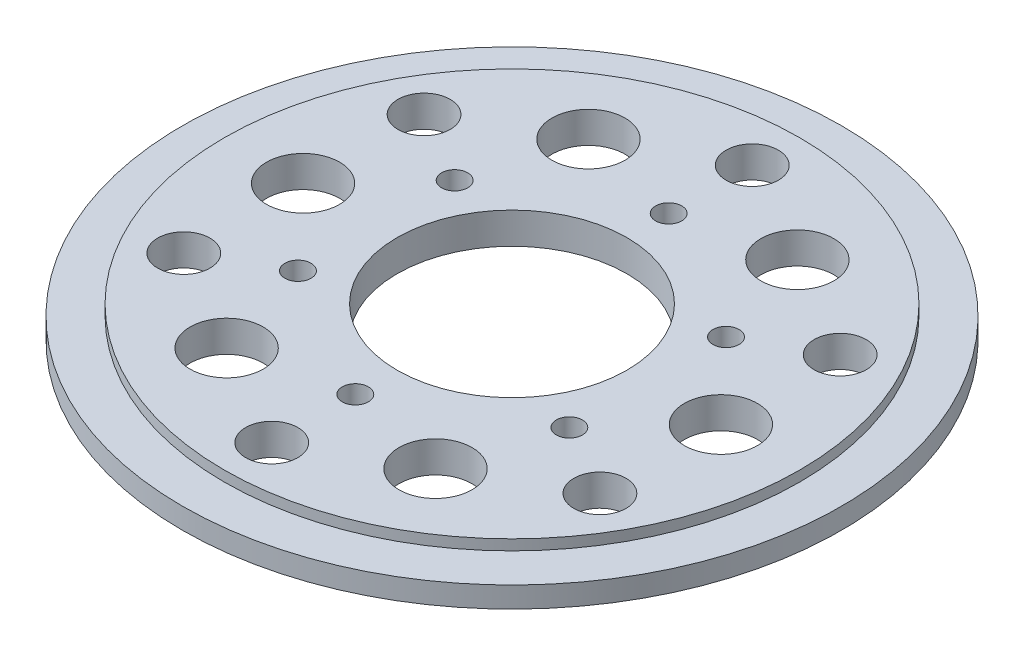
ISO-10303-21;
HEADER;
FILE_DESCRIPTION(('STEP AP214'),'2;1');
FILE_NAME('part.step','',(''),(''),'','','');
FILE_SCHEMA(('AUTOMOTIVE_DESIGN { 1 0 10303 214 1 1 1 1 }'));
ENDSEC;
DATA;
#1=APPLICATION_CONTEXT('core data for automotive mechanical design processes');
#2=APPLICATION_PROTOCOL_DEFINITION('international standard','automotive_design',2000,#1);
#3=PRODUCT_CONTEXT('',#1,'mechanical');
#4=PRODUCT('Part','Part','',(#3));
#5=PRODUCT_RELATED_PRODUCT_CATEGORY('part','',(#4));
#6=PRODUCT_DEFINITION_FORMATION('','',#4);
#7=PRODUCT_DEFINITION_CONTEXT('part definition',#1,'design');
#8=PRODUCT_DEFINITION('design','',#6,#7);
#9=PRODUCT_DEFINITION_SHAPE('','',#8);
#10=(LENGTH_UNIT() NAMED_UNIT(*) SI_UNIT(.MILLI.,.METRE.));
#11=(NAMED_UNIT(*) PLANE_ANGLE_UNIT() SI_UNIT($,.RADIAN.));
#12=(NAMED_UNIT(*) SI_UNIT($,.STERADIAN.) SOLID_ANGLE_UNIT());
#13=UNCERTAINTY_MEASURE_WITH_UNIT(LENGTH_MEASURE(1.E-05),#10,'distance_accuracy_value','');
#14=(GEOMETRIC_REPRESENTATION_CONTEXT(3) GLOBAL_UNCERTAINTY_ASSIGNED_CONTEXT((#13)) GLOBAL_UNIT_ASSIGNED_CONTEXT((#10,
#11,#12)) REPRESENTATION_CONTEXT('',''));
#15=CARTESIAN_POINT('',(0.,0.,0.));
#16=DIRECTION('',(0.,0.,1.));
#17=DIRECTION('',(1.,0.,0.));
#18=AXIS2_PLACEMENT_3D('',#15,#16,#17);
#19=CARTESIAN_POINT('',(0.,3.,0.));
#20=DIRECTION('',(0.,-1.,0.));
#21=DIRECTION('',(0.,0.,-1.));
#22=AXIS2_PLACEMENT_3D('',#19,#20,#21);
#23=CYLINDRICAL_SURFACE('',#22,11.);
#24=CARTESIAN_POINT('',(0.,3.,0.));
#25=DIRECTION('',(0.,1.,0.));
#26=DIRECTION('',(0.,0.,1.));
#27=AXIS2_PLACEMENT_3D('',#24,#25,#26);
#28=CIRCLE('',#27,11.);
#29=CARTESIAN_POINT('',(0.,3.,11.));
#30=VERTEX_POINT('',#29);
#31=EDGE_CURVE('E46',#30,#30,#28,.T.);
#32=ORIENTED_EDGE('',*,*,#31,.T.);
#33=EDGE_LOOP('',(#32));
#34=FACE_BOUND('',#33,.T.);
#35=CARTESIAN_POINT('',(0.,0.,0.));
#36=DIRECTION('',(0.,1.,0.));
#37=DIRECTION('',(0.,0.,1.));
#38=AXIS2_PLACEMENT_3D('',#35,#36,#37);
#39=CIRCLE('',#38,11.);
#40=CARTESIAN_POINT('',(0.,0.,11.));
#41=VERTEX_POINT('',#40);
#42=EDGE_CURVE('E42',#41,#41,#39,.T.);
#43=ORIENTED_EDGE('',*,*,#42,.F.);
#44=EDGE_LOOP('',(#43));
#45=FACE_BOUND('',#44,.T.);
#46=ADVANCED_FACE('F39',(#34,#45),#23,.F.);
#47=CARTESIAN_POINT('',(0.,3.,0.));
#48=DIRECTION('',(0.,-1.,0.));
#49=DIRECTION('',(0.,0.,-1.));
#50=AXIS2_PLACEMENT_3D('',#47,#48,#49);
#51=CYLINDRICAL_SURFACE('',#50,27.55);
#52=CARTESIAN_POINT('',(0.,2.,0.));
#53=DIRECTION('',(0.,1.,0.));
#54=DIRECTION('',(0.,0.,1.));
#55=AXIS2_PLACEMENT_3D('',#52,#53,#54);
#56=CIRCLE('',#55,27.55);
#57=CARTESIAN_POINT('',(0.,2.,27.55));
#58=VERTEX_POINT('',#57);
#59=EDGE_CURVE('E55',#58,#58,#56,.T.);
#60=ORIENTED_EDGE('',*,*,#59,.T.);
#61=EDGE_LOOP('',(#60));
#62=FACE_BOUND('',#61,.T.);
#63=CARTESIAN_POINT('',(0.,3.,0.));
#64=DIRECTION('',(0.,1.,0.));
#65=DIRECTION('',(0.,0.,1.));
#66=AXIS2_PLACEMENT_3D('',#63,#64,#65);
#67=CIRCLE('',#66,27.55);
#68=CARTESIAN_POINT('',(0.,3.,27.55));
#69=VERTEX_POINT('',#68);
#70=EDGE_CURVE('E10',#69,#69,#67,.T.);
#71=ORIENTED_EDGE('',*,*,#70,.F.);
#72=EDGE_LOOP('',(#71));
#73=FACE_BOUND('',#72,.T.);
#74=ADVANCED_FACE('F184',(#62,#73),#51,.T.);
#75=CARTESIAN_POINT('',(0.,3.,0.));
#76=DIRECTION('',(0.,1.,0.));
#77=DIRECTION('',(0.,0.,1.));
#78=AXIS2_PLACEMENT_3D('',#75,#76,#77);
#79=PLANE('',#78);
#80=CARTESIAN_POINT('',(10.0000000000002,3.,17.3205080756887));
#81=DIRECTION('',(0.,1.,0.));
#82=DIRECTION('',(-0.866025403784433,0.,0.50000000000001));
#83=AXIS2_PLACEMENT_3D('',#80,#81,#82);
#84=CIRCLE('',#83,3.5);
#85=CARTESIAN_POINT('',(6.96891108675469,3.,19.0705080756887));
#86=VERTEX_POINT('',#85);
#87=EDGE_CURVE('E140',#86,#86,#84,.T.);
#88=ORIENTED_EDGE('',*,*,#87,.F.);
#89=EDGE_LOOP('',(#88));
#90=FACE_BOUND('',#89,.T.);
#91=CARTESIAN_POINT('',(19.9185842870422,3.,11.4999999999998));
#92=DIRECTION('',(0.,1.,0.));
#93=DIRECTION('',(-0.866025403784443,0.,-0.499999999999992));
#94=AXIS2_PLACEMENT_3D('',#91,#92,#93);
#95=CIRCLE('',#94,2.5);
#96=CARTESIAN_POINT('',(17.7535207775811,3.,10.2499999999998));
#97=VERTEX_POINT('',#96);
#98=EDGE_CURVE('E147',#97,#97,#95,.T.);
#99=ORIENTED_EDGE('',*,*,#98,.F.);
#100=EDGE_LOOP('',(#99));
#101=FACE_BOUND('',#100,.T.);
#102=CARTESIAN_POINT('',(-9.99999999999984,3.,17.3205080756889));
#103=DIRECTION('',(0.,1.,0.));
#104=DIRECTION('',(-0.866025403784443,0.,-0.499999999999992));
#105=AXIS2_PLACEMENT_3D('',#102,#103,#104);
#106=CIRCLE('',#105,3.5);
#107=CARTESIAN_POINT('',(-13.0310889132454,3.,15.5705080756889));
#108=VERTEX_POINT('',#107);
#109=EDGE_CURVE('E153',#108,#108,#106,.T.);
#110=ORIENTED_EDGE('',*,*,#109,.F.);
#111=EDGE_LOOP('',(#110));
#112=FACE_BOUND('',#111,.T.);
#113=CARTESIAN_POINT('',(0.,3.,23.));
#114=DIRECTION('',(0.,1.,0.));
#115=DIRECTION('',(0.,0.,-1.));
#116=AXIS2_PLACEMENT_3D('',#113,#114,#115);
#117=CIRCLE('',#116,2.5);
#118=CARTESIAN_POINT('',(0.,3.,20.5));
#119=VERTEX_POINT('',#118);
#120=EDGE_CURVE('E159',#119,#119,#117,.T.);
#121=ORIENTED_EDGE('',*,*,#120,.F.);
#122=EDGE_LOOP('',(#121));
#123=FACE_BOUND('',#122,.T.);
#124=CARTESIAN_POINT('',(-20.,3.,0.));
#125=DIRECTION('',(0.,1.,0.));
#126=DIRECTION('',(0.,0.,-1.));
#127=AXIS2_PLACEMENT_3D('',#124,#125,#126);
#128=CIRCLE('',#127,3.5);
#129=CARTESIAN_POINT('',(-20.,3.,-3.5));
#130=VERTEX_POINT('',#129);
#131=EDGE_CURVE('E116',#130,#130,#128,.T.);
#132=ORIENTED_EDGE('',*,*,#131,.F.);
#133=EDGE_LOOP('',(#132));
#134=FACE_BOUND('',#133,.T.);
#135=CARTESIAN_POINT('',(-19.918584287042,3.,11.5000000000001));
#136=DIRECTION('',(0.,1.,0.));
#137=DIRECTION('',(0.866025403784436,0.,-0.500000000000004));
#138=AXIS2_PLACEMENT_3D('',#135,#136,#137);
#139=CIRCLE('',#138,2.5);
#140=CARTESIAN_POINT('',(-17.7535207775809,3.,10.2500000000001));
#141=VERTEX_POINT('',#140);
#142=EDGE_CURVE('E123',#141,#141,#139,.T.);
#143=ORIENTED_EDGE('',*,*,#142,.F.);
#144=EDGE_LOOP('',(#143));
#145=FACE_BOUND('',#144,.T.);
#146=CARTESIAN_POINT('',(-10.0000000000001,3.,-17.3205080756887));
#147=DIRECTION('',(0.,1.,0.));
#148=DIRECTION('',(0.866025403784436,0.,-0.500000000000004));
#149=AXIS2_PLACEMENT_3D('',#146,#147,#148);
#150=CIRCLE('',#149,3.5);
#151=CARTESIAN_POINT('',(-6.96891108675455,3.,-19.0705080756887));
#152=VERTEX_POINT('',#151);
#153=EDGE_CURVE('E129',#152,#152,#150,.T.);
#154=ORIENTED_EDGE('',*,*,#153,.F.);
#155=EDGE_LOOP('',(#154));
#156=FACE_BOUND('',#155,.T.);
#157=CARTESIAN_POINT('',(-19.9185842870421,3.,-11.5));
#158=DIRECTION('',(0.,1.,0.));
#159=DIRECTION('',(0.86602540378444,0.,0.499999999999998));
#160=AXIS2_PLACEMENT_3D('',#157,#158,#159);
#161=CIRCLE('',#160,2.5);
#162=CARTESIAN_POINT('',(-17.753520777581,3.,-10.25));
#163=VERTEX_POINT('',#162);
#164=EDGE_CURVE('E135',#163,#163,#161,.T.);
#165=ORIENTED_EDGE('',*,*,#164,.F.);
#166=EDGE_LOOP('',(#165));
#167=FACE_BOUND('',#166,.T.);
#168=CARTESIAN_POINT('',(19.918584287042,3.,-11.5000000000002));
#169=DIRECTION('',(0.,1.,0.));
#170=DIRECTION('',(-0.866025403784433,0.,0.50000000000001));
#171=AXIS2_PLACEMENT_3D('',#168,#169,#170);
#172=CIRCLE('',#171,2.5);
#173=CARTESIAN_POINT('',(17.7535207775809,3.,-10.2500000000002));
#174=VERTEX_POINT('',#173);
#175=EDGE_CURVE('E164',#174,#174,#172,.T.);
#176=ORIENTED_EDGE('',*,*,#175,.F.);
#177=EDGE_LOOP('',(#176));
#178=FACE_BOUND('',#177,.T.);
#179=CARTESIAN_POINT('',(9.99999999999996,3.,-17.3205080756888));
#180=DIRECTION('',(0.,1.,0.));
#181=DIRECTION('',(0.86602540378444,0.,0.499999999999998));
#182=AXIS2_PLACEMENT_3D('',#179,#180,#181);
#183=CIRCLE('',#182,3.5);
#184=CARTESIAN_POINT('',(13.0310889132455,3.,-15.5705080756888));
#185=VERTEX_POINT('',#184);
#186=EDGE_CURVE('E110',#185,#185,#183,.T.);
#187=ORIENTED_EDGE('',*,*,#186,.F.);
#188=EDGE_LOOP('',(#187));
#189=FACE_BOUND('',#188,.T.);
#190=CARTESIAN_POINT('',(12.9903810567665,3.,-7.50000000000015));
#191=DIRECTION('',(0.,1.,0.));
#192=DIRECTION('',(0.,0.,1.));
#193=AXIS2_PLACEMENT_3D('',#190,#191,#192);
#194=CIRCLE('',#193,1.25);
#195=CARTESIAN_POINT('',(12.9903810567665,3.,-6.25000000000015));
#196=VERTEX_POINT('',#195);
#197=EDGE_CURVE('E106',#196,#196,#194,.T.);
#198=ORIENTED_EDGE('',*,*,#197,.F.);
#199=EDGE_LOOP('',(#198));
#200=FACE_BOUND('',#199,.T.);
#201=CARTESIAN_POINT('',(12.9903810567666,3.,7.49999999999988));
#202=DIRECTION('',(0.,1.,0.));
#203=DIRECTION('',(0.,0.,1.));
#204=AXIS2_PLACEMENT_3D('',#201,#202,#203);
#205=CIRCLE('',#204,1.25);
#206=CARTESIAN_POINT('',(12.9903810567666,3.,8.74999999999988));
#207=VERTEX_POINT('',#206);
#208=EDGE_CURVE('E100',#207,#207,#205,.T.);
#209=ORIENTED_EDGE('',*,*,#208,.F.);
#210=EDGE_LOOP('',(#209));
#211=FACE_BOUND('',#210,.T.);
#212=CARTESIAN_POINT('',(0.,3.,15.));
#213=DIRECTION('',(0.,1.,0.));
#214=DIRECTION('',(0.,0.,1.));
#215=AXIS2_PLACEMENT_3D('',#212,#213,#214);
#216=CIRCLE('',#215,1.25);
#217=CARTESIAN_POINT('',(0.,3.,16.25));
#218=VERTEX_POINT('',#217);
#219=EDGE_CURVE('E94',#218,#218,#216,.T.);
#220=ORIENTED_EDGE('',*,*,#219,.F.);
#221=EDGE_LOOP('',(#220));
#222=FACE_BOUND('',#221,.T.);
#223=CARTESIAN_POINT('',(-12.9903810567665,3.,7.50000000000006));
#224=DIRECTION('',(0.,1.,0.));
#225=DIRECTION('',(0.,0.,1.));
#226=AXIS2_PLACEMENT_3D('',#223,#224,#225);
#227=CIRCLE('',#226,1.25);
#228=CARTESIAN_POINT('',(-12.9903810567665,3.,8.75000000000006));
#229=VERTEX_POINT('',#228);
#230=EDGE_CURVE('E88',#229,#229,#227,.T.);
#231=ORIENTED_EDGE('',*,*,#230,.F.);
#232=EDGE_LOOP('',(#231));
#233=FACE_BOUND('',#232,.T.);
#234=CARTESIAN_POINT('',(-12.9903810567666,3.,-7.49999999999997));
#235=DIRECTION('',(0.,1.,0.));
#236=DIRECTION('',(0.,0.,1.));
#237=AXIS2_PLACEMENT_3D('',#234,#235,#236);
#238=CIRCLE('',#237,1.25);
#239=CARTESIAN_POINT('',(-12.9903810567666,3.,-6.24999999999997));
#240=VERTEX_POINT('',#239);
#241=EDGE_CURVE('E82',#240,#240,#238,.T.);
#242=ORIENTED_EDGE('',*,*,#241,.F.);
#243=EDGE_LOOP('',(#242));
#244=FACE_BOUND('',#243,.T.);
#245=CARTESIAN_POINT('',(20.,3.,0.));
#246=DIRECTION('',(0.,1.,0.));
#247=DIRECTION('',(0.,0.,1.));
#248=AXIS2_PLACEMENT_3D('',#245,#246,#247);
#249=CIRCLE('',#248,3.5);
#250=CARTESIAN_POINT('',(20.,3.,3.5));
#251=VERTEX_POINT('',#250);
#252=EDGE_CURVE('E75',#251,#251,#249,.T.);
#253=ORIENTED_EDGE('',*,*,#252,.F.);
#254=EDGE_LOOP('',(#253));
#255=FACE_BOUND('',#254,.T.);
#256=CARTESIAN_POINT('',(0.,3.,-23.));
#257=DIRECTION('',(0.,1.,0.));
#258=DIRECTION('',(0.,0.,1.));
#259=AXIS2_PLACEMENT_3D('',#256,#257,#258);
#260=CIRCLE('',#259,2.5);
#261=CARTESIAN_POINT('',(0.,3.,-20.5));
#262=VERTEX_POINT('',#261);
#263=EDGE_CURVE('E71',#262,#262,#260,.T.);
#264=ORIENTED_EDGE('',*,*,#263,.F.);
#265=EDGE_LOOP('',(#264));
#266=FACE_BOUND('',#265,.T.);
#267=CARTESIAN_POINT('',(0.,3.,-15.));
#268=DIRECTION('',(0.,1.,0.));
#269=DIRECTION('',(0.,0.,1.));
#270=AXIS2_PLACEMENT_3D('',#267,#268,#269);
#271=CIRCLE('',#270,1.25);
#272=CARTESIAN_POINT('',(0.,3.,-13.75));
#273=VERTEX_POINT('',#272);
#274=EDGE_CURVE('E64',#273,#273,#271,.T.);
#275=ORIENTED_EDGE('',*,*,#274,.F.);
#276=EDGE_LOOP('',(#275));
#277=FACE_BOUND('',#276,.T.);
#278=ORIENTED_EDGE('',*,*,#31,.F.);
#279=EDGE_LOOP('',(#278));
#280=FACE_BOUND('',#279,.T.);
#281=ORIENTED_EDGE('',*,*,#70,.T.);
#282=EDGE_LOOP('',(#281));
#283=FACE_BOUND('',#282,.T.);
#284=ADVANCED_FACE('F181',(#90,#101,#112,#123,#134,#145,#156,#167,#178,#189,#200,#211,#222,#233,
#244,#255,#266,#277,#280,#283),#79,.T.);
#285=CARTESIAN_POINT('',(0.,0.,0.));
#286=DIRECTION('',(0.,1.,0.));
#287=DIRECTION('',(0.,0.,1.));
#288=AXIS2_PLACEMENT_3D('',#285,#286,#287);
#289=PLANE('',#288);
#290=CARTESIAN_POINT('',(10.0000000000002,0.,17.3205080756887));
#291=DIRECTION('',(0.,1.,0.));
#292=DIRECTION('',(-0.866025403784433,0.,0.50000000000001));
#293=AXIS2_PLACEMENT_3D('',#290,#291,#292);
#294=CIRCLE('',#293,3.5);
#295=CARTESIAN_POINT('',(6.96891108675469,0.,19.0705080756887));
#296=VERTEX_POINT('',#295);
#297=EDGE_CURVE('E143',#296,#296,#294,.T.);
#298=ORIENTED_EDGE('',*,*,#297,.T.);
#299=EDGE_LOOP('',(#298));
#300=FACE_BOUND('',#299,.T.);
#301=CARTESIAN_POINT('',(19.9185842870422,0.,11.4999999999998));
#302=DIRECTION('',(0.,1.,0.));
#303=DIRECTION('',(-0.866025403784443,0.,-0.499999999999992));
#304=AXIS2_PLACEMENT_3D('',#301,#302,#303);
#305=CIRCLE('',#304,2.5);
#306=CARTESIAN_POINT('',(17.7535207775811,0.,10.2499999999998));
#307=VERTEX_POINT('',#306);
#308=EDGE_CURVE('E150',#307,#307,#305,.T.);
#309=ORIENTED_EDGE('',*,*,#308,.T.);
#310=EDGE_LOOP('',(#309));
#311=FACE_BOUND('',#310,.T.);
#312=CARTESIAN_POINT('',(-9.99999999999984,0.,17.3205080756889));
#313=DIRECTION('',(0.,1.,0.));
#314=DIRECTION('',(-0.866025403784443,0.,-0.499999999999992));
#315=AXIS2_PLACEMENT_3D('',#312,#313,#314);
#316=CIRCLE('',#315,3.5);
#317=CARTESIAN_POINT('',(-13.0310889132454,0.,15.5705080756889));
#318=VERTEX_POINT('',#317);
#319=EDGE_CURVE('E156',#318,#318,#316,.T.);
#320=ORIENTED_EDGE('',*,*,#319,.T.);
#321=EDGE_LOOP('',(#320));
#322=FACE_BOUND('',#321,.T.);
#323=CARTESIAN_POINT('',(0.,0.,23.));
#324=DIRECTION('',(0.,1.,0.));
#325=DIRECTION('',(0.,0.,-1.));
#326=AXIS2_PLACEMENT_3D('',#323,#324,#325);
#327=CIRCLE('',#326,2.5);
#328=CARTESIAN_POINT('',(0.,0.,20.5));
#329=VERTEX_POINT('',#328);
#330=EDGE_CURVE('E120',#329,#329,#327,.T.);
#331=ORIENTED_EDGE('',*,*,#330,.T.);
#332=EDGE_LOOP('',(#331));
#333=FACE_BOUND('',#332,.T.);
#334=CARTESIAN_POINT('',(-20.,0.,0.));
#335=DIRECTION('',(0.,1.,0.));
#336=DIRECTION('',(0.,0.,-1.));
#337=AXIS2_PLACEMENT_3D('',#334,#335,#336);
#338=CIRCLE('',#337,3.5);
#339=CARTESIAN_POINT('',(-20.,0.,-3.5));
#340=VERTEX_POINT('',#339);
#341=EDGE_CURVE('E119',#340,#340,#338,.T.);
#342=ORIENTED_EDGE('',*,*,#341,.T.);
#343=EDGE_LOOP('',(#342));
#344=FACE_BOUND('',#343,.T.);
#345=CARTESIAN_POINT('',(-19.918584287042,0.,11.5000000000001));
#346=DIRECTION('',(0.,1.,0.));
#347=DIRECTION('',(0.866025403784436,0.,-0.500000000000004));
#348=AXIS2_PLACEMENT_3D('',#345,#346,#347);
#349=CIRCLE('',#348,2.5);
#350=CARTESIAN_POINT('',(-17.7535207775809,0.,10.2500000000001));
#351=VERTEX_POINT('',#350);
#352=EDGE_CURVE('E126',#351,#351,#349,.T.);
#353=ORIENTED_EDGE('',*,*,#352,.T.);
#354=EDGE_LOOP('',(#353));
#355=FACE_BOUND('',#354,.T.);
#356=CARTESIAN_POINT('',(-10.0000000000001,0.,-17.3205080756887));
#357=DIRECTION('',(0.,1.,0.));
#358=DIRECTION('',(0.866025403784436,0.,-0.500000000000004));
#359=AXIS2_PLACEMENT_3D('',#356,#357,#358);
#360=CIRCLE('',#359,3.5);
#361=CARTESIAN_POINT('',(-6.96891108675455,0.,-19.0705080756887));
#362=VERTEX_POINT('',#361);
#363=EDGE_CURVE('E132',#362,#362,#360,.T.);
#364=ORIENTED_EDGE('',*,*,#363,.T.);
#365=EDGE_LOOP('',(#364));
#366=FACE_BOUND('',#365,.T.);
#367=CARTESIAN_POINT('',(-19.9185842870421,0.,-11.5));
#368=DIRECTION('',(0.,1.,0.));
#369=DIRECTION('',(0.86602540378444,0.,0.499999999999998));
#370=AXIS2_PLACEMENT_3D('',#367,#368,#369);
#371=CIRCLE('',#370,2.5);
#372=CARTESIAN_POINT('',(-17.753520777581,0.,-10.25));
#373=VERTEX_POINT('',#372);
#374=EDGE_CURVE('E113',#373,#373,#371,.T.);
#375=ORIENTED_EDGE('',*,*,#374,.T.);
#376=EDGE_LOOP('',(#375));
#377=FACE_BOUND('',#376,.T.);
#378=CARTESIAN_POINT('',(19.918584287042,0.,-11.5000000000002));
#379=DIRECTION('',(0.,1.,0.));
#380=DIRECTION('',(-0.866025403784433,0.,0.50000000000001));
#381=AXIS2_PLACEMENT_3D('',#378,#379,#380);
#382=CIRCLE('',#381,2.5);
#383=CARTESIAN_POINT('',(17.7535207775809,0.,-10.2500000000002));
#384=VERTEX_POINT('',#383);
#385=EDGE_CURVE('E144',#384,#384,#382,.T.);
#386=ORIENTED_EDGE('',*,*,#385,.T.);
#387=EDGE_LOOP('',(#386));
#388=FACE_BOUND('',#387,.T.);
#389=CARTESIAN_POINT('',(9.99999999999996,0.,-17.3205080756888));
#390=DIRECTION('',(0.,1.,0.));
#391=DIRECTION('',(0.86602540378444,0.,0.499999999999998));
#392=AXIS2_PLACEMENT_3D('',#389,#390,#391);
#393=CIRCLE('',#392,3.5);
#394=CARTESIAN_POINT('',(13.0310889132455,0.,-15.5705080756888));
#395=VERTEX_POINT('',#394);
#396=EDGE_CURVE('E109',#395,#395,#393,.T.);
#397=ORIENTED_EDGE('',*,*,#396,.T.);
#398=EDGE_LOOP('',(#397));
#399=FACE_BOUND('',#398,.T.);
#400=CARTESIAN_POINT('',(12.9903810567665,0.,-7.50000000000015));
#401=DIRECTION('',(0.,1.,0.));
#402=DIRECTION('',(0.,0.,1.));
#403=AXIS2_PLACEMENT_3D('',#400,#401,#402);
#404=CIRCLE('',#403,1.25);
#405=CARTESIAN_POINT('',(12.9903810567665,0.,-6.25000000000015));
#406=VERTEX_POINT('',#405);
#407=EDGE_CURVE('E103',#406,#406,#404,.T.);
#408=ORIENTED_EDGE('',*,*,#407,.T.);
#409=EDGE_LOOP('',(#408));
#410=FACE_BOUND('',#409,.T.);
#411=CARTESIAN_POINT('',(12.9903810567666,0.,7.49999999999988));
#412=DIRECTION('',(0.,1.,0.));
#413=DIRECTION('',(0.,0.,1.));
#414=AXIS2_PLACEMENT_3D('',#411,#412,#413);
#415=CIRCLE('',#414,1.25);
#416=CARTESIAN_POINT('',(12.9903810567666,0.,8.74999999999988));
#417=VERTEX_POINT('',#416);
#418=EDGE_CURVE('E97',#417,#417,#415,.T.);
#419=ORIENTED_EDGE('',*,*,#418,.T.);
#420=EDGE_LOOP('',(#419));
#421=FACE_BOUND('',#420,.T.);
#422=CARTESIAN_POINT('',(0.,0.,15.));
#423=DIRECTION('',(0.,1.,0.));
#424=DIRECTION('',(0.,0.,1.));
#425=AXIS2_PLACEMENT_3D('',#422,#423,#424);
#426=CIRCLE('',#425,1.25);
#427=CARTESIAN_POINT('',(0.,0.,16.25));
#428=VERTEX_POINT('',#427);
#429=EDGE_CURVE('E91',#428,#428,#426,.T.);
#430=ORIENTED_EDGE('',*,*,#429,.T.);
#431=EDGE_LOOP('',(#430));
#432=FACE_BOUND('',#431,.T.);
#433=CARTESIAN_POINT('',(-12.9903810567665,0.,7.50000000000006));
#434=DIRECTION('',(0.,1.,0.));
#435=DIRECTION('',(0.,0.,1.));
#436=AXIS2_PLACEMENT_3D('',#433,#434,#435);
#437=CIRCLE('',#436,1.25);
#438=CARTESIAN_POINT('',(-12.9903810567665,0.,8.75000000000006));
#439=VERTEX_POINT('',#438);
#440=EDGE_CURVE('E85',#439,#439,#437,.T.);
#441=ORIENTED_EDGE('',*,*,#440,.T.);
#442=EDGE_LOOP('',(#441));
#443=FACE_BOUND('',#442,.T.);
#444=CARTESIAN_POINT('',(-12.9903810567666,0.,-7.49999999999997));
#445=DIRECTION('',(0.,1.,0.));
#446=DIRECTION('',(0.,0.,1.));
#447=AXIS2_PLACEMENT_3D('',#444,#445,#446);
#448=CIRCLE('',#447,1.25);
#449=CARTESIAN_POINT('',(-12.9903810567666,0.,-6.24999999999997));
#450=VERTEX_POINT('',#449);
#451=EDGE_CURVE('E72',#450,#450,#448,.T.);
#452=ORIENTED_EDGE('',*,*,#451,.T.);
#453=EDGE_LOOP('',(#452));
#454=FACE_BOUND('',#453,.T.);
#455=CARTESIAN_POINT('',(20.,0.,0.));
#456=DIRECTION('',(0.,1.,0.));
#457=DIRECTION('',(0.,0.,1.));
#458=AXIS2_PLACEMENT_3D('',#455,#456,#457);
#459=CIRCLE('',#458,3.5);
#460=CARTESIAN_POINT('',(20.,0.,3.5));
#461=VERTEX_POINT('',#460);
#462=EDGE_CURVE('E67',#461,#461,#459,.T.);
#463=ORIENTED_EDGE('',*,*,#462,.T.);
#464=EDGE_LOOP('',(#463));
#465=FACE_BOUND('',#464,.T.);
#466=CARTESIAN_POINT('',(0.,0.,-23.));
#467=DIRECTION('',(0.,1.,0.));
#468=DIRECTION('',(0.,0.,1.));
#469=AXIS2_PLACEMENT_3D('',#466,#467,#468);
#470=CIRCLE('',#469,2.5);
#471=CARTESIAN_POINT('',(0.,0.,-20.5));
#472=VERTEX_POINT('',#471);
#473=EDGE_CURVE('E68',#472,#472,#470,.T.);
#474=ORIENTED_EDGE('',*,*,#473,.T.);
#475=EDGE_LOOP('',(#474));
#476=FACE_BOUND('',#475,.T.);
#477=CARTESIAN_POINT('',(0.,0.,-15.));
#478=DIRECTION('',(0.,1.,0.));
#479=DIRECTION('',(0.,0.,1.));
#480=AXIS2_PLACEMENT_3D('',#477,#478,#479);
#481=CIRCLE('',#480,1.25);
#482=CARTESIAN_POINT('',(0.,0.,-13.75));
#483=VERTEX_POINT('',#482);
#484=EDGE_CURVE('E56',#483,#483,#481,.T.);
#485=ORIENTED_EDGE('',*,*,#484,.T.);
#486=EDGE_LOOP('',(#485));
#487=FACE_BOUND('',#486,.T.);
#488=ORIENTED_EDGE('',*,*,#42,.T.);
#489=EDGE_LOOP('',(#488));
#490=FACE_BOUND('',#489,.T.);
#491=CARTESIAN_POINT('',(0.,0.,0.));
#492=DIRECTION('',(0.,1.,0.));
#493=DIRECTION('',(0.,0.,1.));
#494=AXIS2_PLACEMENT_3D('',#491,#492,#493);
#495=CIRCLE('',#494,31.55);
#496=CARTESIAN_POINT('',(0.,0.,31.55));
#497=VERTEX_POINT('',#496);
#498=EDGE_CURVE('E52',#497,#497,#495,.T.);
#499=ORIENTED_EDGE('',*,*,#498,.F.);
#500=EDGE_LOOP('',(#499));
#501=FACE_BOUND('',#500,.T.);
#502=ADVANCED_FACE('F170',(#300,#311,#322,#333,#344,#355,#366,#377,#388,#399,#410,#421,#432,
#443,#454,#465,#476,#487,#490,#501),#289,.F.);
#503=CARTESIAN_POINT('',(0.,2.,0.));
#504=DIRECTION('',(0.,-1.,0.));
#505=DIRECTION('',(0.,0.,-1.));
#506=AXIS2_PLACEMENT_3D('',#503,#504,#505);
#507=CYLINDRICAL_SURFACE('',#506,31.55);
#508=CARTESIAN_POINT('',(0.,2.,0.));
#509=DIRECTION('',(0.,1.,0.));
#510=DIRECTION('',(0.,0.,1.));
#511=AXIS2_PLACEMENT_3D('',#508,#509,#510);
#512=CIRCLE('',#511,31.55);
#513=CARTESIAN_POINT('',(0.,2.,31.55));
#514=VERTEX_POINT('',#513);
#515=EDGE_CURVE('E57',#514,#514,#512,.T.);
#516=ORIENTED_EDGE('',*,*,#515,.F.);
#517=EDGE_LOOP('',(#516));
#518=FACE_BOUND('',#517,.T.);
#519=ORIENTED_EDGE('',*,*,#498,.T.);
#520=EDGE_LOOP('',(#519));
#521=FACE_BOUND('',#520,.T.);
#522=ADVANCED_FACE('F214',(#518,#521),#507,.T.);
#523=CARTESIAN_POINT('',(0.,2.,0.));
#524=DIRECTION('',(0.,1.,0.));
#525=DIRECTION('',(0.,0.,1.));
#526=AXIS2_PLACEMENT_3D('',#523,#524,#525);
#527=PLANE('',#526);
#528=ORIENTED_EDGE('',*,*,#59,.F.);
#529=EDGE_LOOP('',(#528));
#530=FACE_BOUND('',#529,.T.);
#531=ORIENTED_EDGE('',*,*,#515,.T.);
#532=EDGE_LOOP('',(#531));
#533=FACE_BOUND('',#532,.T.);
#534=ADVANCED_FACE('F220',(#530,#533),#527,.T.);
#535=CARTESIAN_POINT('',(0.,3.,-15.));
#536=DIRECTION('',(0.,1.,0.));
#537=DIRECTION('',(0.,0.,1.));
#538=AXIS2_PLACEMENT_3D('',#535,#536,#537);
#539=CYLINDRICAL_SURFACE('',#538,1.25);
#540=ORIENTED_EDGE('',*,*,#484,.F.);
#541=EDGE_LOOP('',(#540));
#542=FACE_BOUND('',#541,.T.);
#543=ORIENTED_EDGE('',*,*,#274,.T.);
#544=EDGE_LOOP('',(#543));
#545=FACE_BOUND('',#544,.T.);
#546=ADVANCED_FACE('F227',(#542,#545),#539,.F.);
#547=CARTESIAN_POINT('',(0.,0.,-23.));
#548=DIRECTION('',(0.,1.,0.));
#549=DIRECTION('',(0.,0.,1.));
#550=AXIS2_PLACEMENT_3D('',#547,#548,#549);
#551=CYLINDRICAL_SURFACE('',#550,2.5);
#552=ORIENTED_EDGE('',*,*,#473,.F.);
#553=EDGE_LOOP('',(#552));
#554=FACE_BOUND('',#553,.T.);
#555=ORIENTED_EDGE('',*,*,#263,.T.);
#556=EDGE_LOOP('',(#555));
#557=FACE_BOUND('',#556,.T.);
#558=ADVANCED_FACE('F273',(#554,#557),#551,.F.);
#559=CARTESIAN_POINT('',(20.,0.,0.));
#560=DIRECTION('',(0.,1.,0.));
#561=DIRECTION('',(0.,0.,1.));
#562=AXIS2_PLACEMENT_3D('',#559,#560,#561);
#563=CYLINDRICAL_SURFACE('',#562,3.5);
#564=ORIENTED_EDGE('',*,*,#462,.F.);
#565=EDGE_LOOP('',(#564));
#566=FACE_BOUND('',#565,.T.);
#567=ORIENTED_EDGE('',*,*,#252,.T.);
#568=EDGE_LOOP('',(#567));
#569=FACE_BOUND('',#568,.T.);
#570=ADVANCED_FACE('F281',(#566,#569),#563,.F.);
#571=CARTESIAN_POINT('',(-12.9903810567666,3.,-7.49999999999997));
#572=DIRECTION('',(0.,1.,0.));
#573=DIRECTION('',(0.,0.,1.));
#574=AXIS2_PLACEMENT_3D('',#571,#572,#573);
#575=CYLINDRICAL_SURFACE('',#574,1.25);
#576=ORIENTED_EDGE('',*,*,#451,.F.);
#577=EDGE_LOOP('',(#576));
#578=FACE_BOUND('',#577,.T.);
#579=ORIENTED_EDGE('',*,*,#241,.T.);
#580=EDGE_LOOP('',(#579));
#581=FACE_BOUND('',#580,.T.);
#582=ADVANCED_FACE('F290',(#578,#581),#575,.F.);
#583=CARTESIAN_POINT('',(-12.9903810567665,3.,7.50000000000006));
#584=DIRECTION('',(0.,1.,0.));
#585=DIRECTION('',(0.,0.,1.));
#586=AXIS2_PLACEMENT_3D('',#583,#584,#585);
#587=CYLINDRICAL_SURFACE('',#586,1.25);
#588=ORIENTED_EDGE('',*,*,#440,.F.);
#589=EDGE_LOOP('',(#588));
#590=FACE_BOUND('',#589,.T.);
#591=ORIENTED_EDGE('',*,*,#230,.T.);
#592=EDGE_LOOP('',(#591));
#593=FACE_BOUND('',#592,.T.);
#594=ADVANCED_FACE('F299',(#590,#593),#587,.F.);
#595=CARTESIAN_POINT('',(0.,3.,15.));
#596=DIRECTION('',(0.,1.,0.));
#597=DIRECTION('',(0.,0.,1.));
#598=AXIS2_PLACEMENT_3D('',#595,#596,#597);
#599=CYLINDRICAL_SURFACE('',#598,1.25);
#600=ORIENTED_EDGE('',*,*,#429,.F.);
#601=EDGE_LOOP('',(#600));
#602=FACE_BOUND('',#601,.T.);
#603=ORIENTED_EDGE('',*,*,#219,.T.);
#604=EDGE_LOOP('',(#603));
#605=FACE_BOUND('',#604,.T.);
#606=ADVANCED_FACE('F308',(#602,#605),#599,.F.);
#607=CARTESIAN_POINT('',(12.9903810567666,3.,7.49999999999988));
#608=DIRECTION('',(0.,1.,0.));
#609=DIRECTION('',(0.,0.,1.));
#610=AXIS2_PLACEMENT_3D('',#607,#608,#609);
#611=CYLINDRICAL_SURFACE('',#610,1.25);
#612=ORIENTED_EDGE('',*,*,#418,.F.);
#613=EDGE_LOOP('',(#612));
#614=FACE_BOUND('',#613,.T.);
#615=ORIENTED_EDGE('',*,*,#208,.T.);
#616=EDGE_LOOP('',(#615));
#617=FACE_BOUND('',#616,.T.);
#618=ADVANCED_FACE('F317',(#614,#617),#611,.F.);
#619=CARTESIAN_POINT('',(12.9903810567665,3.,-7.50000000000015));
#620=DIRECTION('',(0.,1.,0.));
#621=DIRECTION('',(0.,0.,1.));
#622=AXIS2_PLACEMENT_3D('',#619,#620,#621);
#623=CYLINDRICAL_SURFACE('',#622,1.25);
#624=ORIENTED_EDGE('',*,*,#407,.F.);
#625=EDGE_LOOP('',(#624));
#626=FACE_BOUND('',#625,.T.);
#627=ORIENTED_EDGE('',*,*,#197,.T.);
#628=EDGE_LOOP('',(#627));
#629=FACE_BOUND('',#628,.T.);
#630=ADVANCED_FACE('F326',(#626,#629),#623,.F.);
#631=CARTESIAN_POINT('',(9.99999999999996,0.,-17.3205080756888));
#632=DIRECTION('',(0.,1.,0.));
#633=DIRECTION('',(0.,0.,1.));
#634=AXIS2_PLACEMENT_3D('',#631,#632,#633);
#635=CYLINDRICAL_SURFACE('',#634,3.5);
#636=ORIENTED_EDGE('',*,*,#396,.F.);
#637=EDGE_LOOP('',(#636));
#638=FACE_BOUND('',#637,.T.);
#639=ORIENTED_EDGE('',*,*,#186,.T.);
#640=EDGE_LOOP('',(#639));
#641=FACE_BOUND('',#640,.T.);
#642=ADVANCED_FACE('F177',(#638,#641),#635,.F.);
#643=CARTESIAN_POINT('',(19.918584287042,0.,-11.5000000000002));
#644=DIRECTION('',(0.,1.,0.));
#645=DIRECTION('',(0.,0.,1.));
#646=AXIS2_PLACEMENT_3D('',#643,#644,#645);
#647=CYLINDRICAL_SURFACE('',#646,2.5);
#648=ORIENTED_EDGE('',*,*,#385,.F.);
#649=EDGE_LOOP('',(#648));
#650=FACE_BOUND('',#649,.T.);
#651=ORIENTED_EDGE('',*,*,#175,.T.);
#652=EDGE_LOOP('',(#651));
#653=FACE_BOUND('',#652,.T.);
#654=ADVANCED_FACE('F173',(#650,#653),#647,.F.);
#655=CARTESIAN_POINT('',(-19.9185842870421,0.,-11.5));
#656=DIRECTION('',(0.,1.,0.));
#657=DIRECTION('',(0.,0.,1.));
#658=AXIS2_PLACEMENT_3D('',#655,#656,#657);
#659=CYLINDRICAL_SURFACE('',#658,2.5);
#660=ORIENTED_EDGE('',*,*,#374,.F.);
#661=EDGE_LOOP('',(#660));
#662=FACE_BOUND('',#661,.T.);
#663=ORIENTED_EDGE('',*,*,#164,.T.);
#664=EDGE_LOOP('',(#663));
#665=FACE_BOUND('',#664,.T.);
#666=ADVANCED_FACE('F176',(#662,#665),#659,.F.);
#667=CARTESIAN_POINT('',(-10.0000000000001,0.,-17.3205080756887));
#668=DIRECTION('',(0.,1.,0.));
#669=DIRECTION('',(0.,0.,1.));
#670=AXIS2_PLACEMENT_3D('',#667,#668,#669);
#671=CYLINDRICAL_SURFACE('',#670,3.5);
#672=ORIENTED_EDGE('',*,*,#363,.F.);
#673=EDGE_LOOP('',(#672));
#674=FACE_BOUND('',#673,.T.);
#675=ORIENTED_EDGE('',*,*,#153,.T.);
#676=EDGE_LOOP('',(#675));
#677=FACE_BOUND('',#676,.T.);
#678=ADVANCED_FACE('F356',(#674,#677),#671,.F.);
#679=CARTESIAN_POINT('',(-19.918584287042,0.,11.5000000000001));
#680=DIRECTION('',(0.,1.,0.));
#681=DIRECTION('',(0.,0.,1.));
#682=AXIS2_PLACEMENT_3D('',#679,#680,#681);
#683=CYLINDRICAL_SURFACE('',#682,2.5);
#684=ORIENTED_EDGE('',*,*,#352,.F.);
#685=EDGE_LOOP('',(#684));
#686=FACE_BOUND('',#685,.T.);
#687=ORIENTED_EDGE('',*,*,#142,.T.);
#688=EDGE_LOOP('',(#687));
#689=FACE_BOUND('',#688,.T.);
#690=ADVANCED_FACE('F365',(#686,#689),#683,.F.);
#691=CARTESIAN_POINT('',(-20.,0.,0.));
#692=DIRECTION('',(0.,1.,0.));
#693=DIRECTION('',(0.,0.,1.));
#694=AXIS2_PLACEMENT_3D('',#691,#692,#693);
#695=CYLINDRICAL_SURFACE('',#694,3.5);
#696=ORIENTED_EDGE('',*,*,#341,.F.);
#697=EDGE_LOOP('',(#696));
#698=FACE_BOUND('',#697,.T.);
#699=ORIENTED_EDGE('',*,*,#131,.T.);
#700=EDGE_LOOP('',(#699));
#701=FACE_BOUND('',#700,.T.);
#702=ADVANCED_FACE('F374',(#698,#701),#695,.F.);
#703=CARTESIAN_POINT('',(0.,0.,23.));
#704=DIRECTION('',(0.,1.,0.));
#705=DIRECTION('',(0.,0.,1.));
#706=AXIS2_PLACEMENT_3D('',#703,#704,#705);
#707=CYLINDRICAL_SURFACE('',#706,2.5);
#708=ORIENTED_EDGE('',*,*,#330,.F.);
#709=EDGE_LOOP('',(#708));
#710=FACE_BOUND('',#709,.T.);
#711=ORIENTED_EDGE('',*,*,#120,.T.);
#712=EDGE_LOOP('',(#711));
#713=FACE_BOUND('',#712,.T.);
#714=ADVANCED_FACE('F383',(#710,#713),#707,.F.);
#715=CARTESIAN_POINT('',(-9.99999999999984,0.,17.3205080756889));
#716=DIRECTION('',(0.,1.,0.));
#717=DIRECTION('',(0.,0.,1.));
#718=AXIS2_PLACEMENT_3D('',#715,#716,#717);
#719=CYLINDRICAL_SURFACE('',#718,3.5);
#720=ORIENTED_EDGE('',*,*,#319,.F.);
#721=EDGE_LOOP('',(#720));
#722=FACE_BOUND('',#721,.T.);
#723=ORIENTED_EDGE('',*,*,#109,.T.);
#724=EDGE_LOOP('',(#723));
#725=FACE_BOUND('',#724,.T.);
#726=ADVANCED_FACE('F392',(#722,#725),#719,.F.);
#727=CARTESIAN_POINT('',(19.9185842870422,0.,11.4999999999998));
#728=DIRECTION('',(0.,1.,0.));
#729=DIRECTION('',(0.,0.,1.));
#730=AXIS2_PLACEMENT_3D('',#727,#728,#729);
#731=CYLINDRICAL_SURFACE('',#730,2.5);
#732=ORIENTED_EDGE('',*,*,#308,.F.);
#733=EDGE_LOOP('',(#732));
#734=FACE_BOUND('',#733,.T.);
#735=ORIENTED_EDGE('',*,*,#98,.T.);
#736=EDGE_LOOP('',(#735));
#737=FACE_BOUND('',#736,.T.);
#738=ADVANCED_FACE('F401',(#734,#737),#731,.F.);
#739=CARTESIAN_POINT('',(10.0000000000002,0.,17.3205080756887));
#740=DIRECTION('',(0.,1.,0.));
#741=DIRECTION('',(0.,0.,1.));
#742=AXIS2_PLACEMENT_3D('',#739,#740,#741);
#743=CYLINDRICAL_SURFACE('',#742,3.5);
#744=ORIENTED_EDGE('',*,*,#297,.F.);
#745=EDGE_LOOP('',(#744));
#746=FACE_BOUND('',#745,.T.);
#747=ORIENTED_EDGE('',*,*,#87,.T.);
#748=EDGE_LOOP('',(#747));
#749=FACE_BOUND('',#748,.T.);
#750=ADVANCED_FACE('F410',(#746,#749),#743,.F.);
#751=CLOSED_SHELL('',(#46,#74,#284,#502,#522,#534,#546,#558,#570,#582,#594,#606,#618,#630,#642,
#654,#666,#678,#690,#702,#714,#726,#738,#750));
#752=MANIFOLD_SOLID_BREP('B2',#751);
#753=ADVANCED_BREP_SHAPE_REPRESENTATION('',(#18,#752),#14);
#754=SHAPE_DEFINITION_REPRESENTATION(#9,#753);
ENDSEC;
END-ISO-10303-21;
